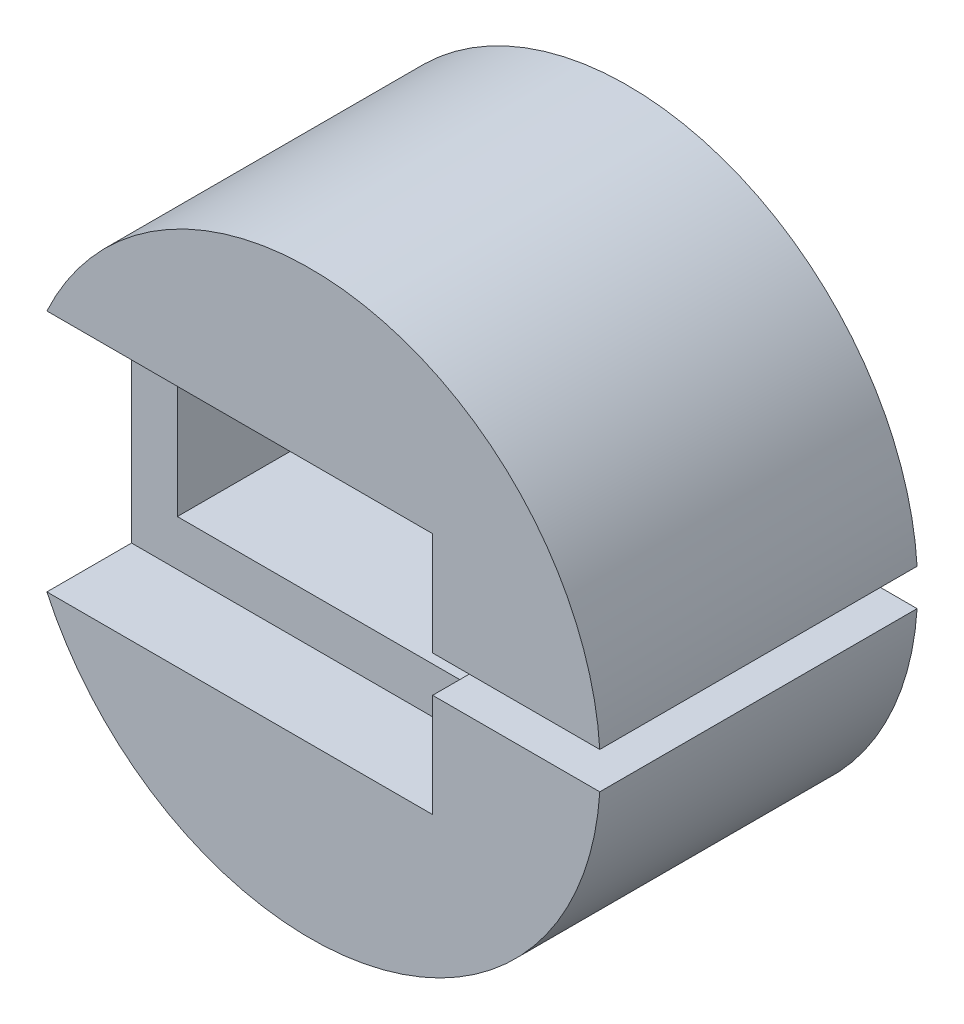
ISO-10303-21;
HEADER;
FILE_DESCRIPTION(('STEP AP214'),'2;1');
FILE_NAME('part.step','',(''),(''),'','','');
FILE_SCHEMA(('AUTOMOTIVE_DESIGN { 1 0 10303 214 1 1 1 1 }'));
ENDSEC;
DATA;
#1=APPLICATION_CONTEXT('core data for automotive mechanical design processes');
#2=APPLICATION_PROTOCOL_DEFINITION('international standard','automotive_design',2000,#1);
#3=PRODUCT_CONTEXT('',#1,'mechanical');
#4=PRODUCT('Part','Part','',(#3));
#5=PRODUCT_RELATED_PRODUCT_CATEGORY('part','',(#4));
#6=PRODUCT_DEFINITION_FORMATION('','',#4);
#7=PRODUCT_DEFINITION_CONTEXT('part definition',#1,'design');
#8=PRODUCT_DEFINITION('design','',#6,#7);
#9=PRODUCT_DEFINITION_SHAPE('','',#8);
#10=(LENGTH_UNIT() NAMED_UNIT(*) SI_UNIT(.MILLI.,.METRE.));
#11=(NAMED_UNIT(*) PLANE_ANGLE_UNIT() SI_UNIT($,.RADIAN.));
#12=(NAMED_UNIT(*) SI_UNIT($,.STERADIAN.) SOLID_ANGLE_UNIT());
#13=UNCERTAINTY_MEASURE_WITH_UNIT(LENGTH_MEASURE(1.E-05),#10,'distance_accuracy_value','');
#14=(GEOMETRIC_REPRESENTATION_CONTEXT(3) GLOBAL_UNCERTAINTY_ASSIGNED_CONTEXT((#13)) GLOBAL_UNIT_ASSIGNED_CONTEXT((#10,
#11,#12)) REPRESENTATION_CONTEXT('',''));
#15=CARTESIAN_POINT('',(0.,0.,0.));
#16=DIRECTION('',(0.,0.,1.));
#17=DIRECTION('',(1.,0.,0.));
#18=AXIS2_PLACEMENT_3D('',#15,#16,#17);
#19=CARTESIAN_POINT('',(10.849101298564,4.60000000000001,-92.6685344645156));
#20=DIRECTION('',(-1.,0.,0.));
#21=DIRECTION('',(0.,0.,1.));
#22=AXIS2_PLACEMENT_3D('',#19,#20,#21);
#23=PLANE('',#22);
#24=DIRECTION('',(0.,1.,0.));
#25=VECTOR('',#24,1.);
#26=CARTESIAN_POINT('',(10.849101298564,4.60000000000001,-28.));
#27=LINE('',#26,#25);
#28=CARTESIAN_POINT('',(10.849101298564,4.60000000000001,-28.));
#29=VERTEX_POINT('',#28);
#30=CARTESIAN_POINT('',(10.849101298564,10.749101298564,-28.));
#31=VERTEX_POINT('',#30);
#32=EDGE_CURVE('E46',#29,#31,#27,.T.);
#33=ORIENTED_EDGE('',*,*,#32,.F.);
#34=DIRECTION('',(0.,0.,1.));
#35=VECTOR('',#34,1.);
#36=CARTESIAN_POINT('',(10.849101298564,4.60000000000001,-92.6685344645156));
#37=LINE('',#36,#35);
#38=CARTESIAN_POINT('',(10.849101298564,4.60000000000001,0.));
#39=VERTEX_POINT('',#38);
#40=EDGE_CURVE('E162',#29,#39,#37,.T.);
#41=ORIENTED_EDGE('',*,*,#40,.T.);
#42=DIRECTION('',(0.,-1.,0.));
#43=VECTOR('',#42,1.);
#44=CARTESIAN_POINT('',(10.849101298564,4.60000000000001,0.));
#45=LINE('',#44,#43);
#46=CARTESIAN_POINT('',(10.849101298564,10.749101298564,0.));
#47=VERTEX_POINT('',#46);
#48=EDGE_CURVE('E124',#47,#39,#45,.T.);
#49=ORIENTED_EDGE('',*,*,#48,.F.);
#50=DIRECTION('',(0.,0.,1.));
#51=VECTOR('',#50,1.);
#52=CARTESIAN_POINT('',(10.849101298564,10.749101298564,-92.6685344645156));
#53=LINE('',#52,#51);
#54=EDGE_CURVE('E163',#31,#47,#53,.T.);
#55=ORIENTED_EDGE('',*,*,#54,.F.);
#56=EDGE_LOOP('',(#33,#41,#49,#55));
#57=FACE_BOUND('',#56,.T.);
#58=ADVANCED_FACE('F39',(#57),#23,.T.);
#59=CARTESIAN_POINT('',(10.849101298564,10.749101298564,-92.6685344645156));
#60=DIRECTION('',(0.,-1.,0.));
#61=DIRECTION('',(0.,0.,-1.));
#62=AXIS2_PLACEMENT_3D('',#59,#60,#61);
#63=PLANE('',#62);
#64=DIRECTION('',(-1.,0.,0.));
#65=VECTOR('',#64,1.);
#66=CARTESIAN_POINT('',(10.849101298564,10.749101298564,-28.));
#67=LINE('',#66,#65);
#68=CARTESIAN_POINT('',(-30.84910129856,10.749101298564,-28.));
#69=VERTEX_POINT('',#68);
#70=EDGE_CURVE('E75',#31,#69,#67,.T.);
#71=ORIENTED_EDGE('',*,*,#70,.F.);
#72=ORIENTED_EDGE('',*,*,#54,.T.);
#73=DIRECTION('',(1.,0.,0.));
#74=VECTOR('',#73,1.);
#75=CARTESIAN_POINT('',(10.849101298564,10.749101298564,0.));
#76=LINE('',#75,#74);
#77=CARTESIAN_POINT('',(-30.84910129856,10.749101298564,0.));
#78=VERTEX_POINT('',#77);
#79=EDGE_CURVE('E159',#78,#47,#76,.T.);
#80=ORIENTED_EDGE('',*,*,#79,.F.);
#81=DIRECTION('',(0.,0.,1.));
#82=VECTOR('',#81,1.);
#83=CARTESIAN_POINT('',(-30.84910129856,10.749101298564,-92.6685344645156));
#84=LINE('',#83,#82);
#85=EDGE_CURVE('E111',#69,#78,#84,.T.);
#86=ORIENTED_EDGE('',*,*,#85,.F.);
#87=EDGE_LOOP('',(#71,#72,#80,#86));
#88=FACE_BOUND('',#87,.T.);
#89=ADVANCED_FACE('F194',(#88),#63,.T.);
#90=CARTESIAN_POINT('',(-30.84910129856,10.749101298564,-92.6685344645156));
#91=DIRECTION('',(1.,0.,0.));
#92=DIRECTION('',(0.,0.,-1.));
#93=AXIS2_PLACEMENT_3D('',#90,#91,#92);
#94=PLANE('',#93);
#95=DIRECTION('',(0.,-1.,0.));
#96=VECTOR('',#95,1.);
#97=CARTESIAN_POINT('',(-30.84910129856,10.749101298564,-28.));
#98=LINE('',#97,#96);
#99=CARTESIAN_POINT('',(-30.84910129856,-10.74910129856,-28.));
#100=VERTEX_POINT('',#99);
#101=EDGE_CURVE('E104',#69,#100,#98,.T.);
#102=ORIENTED_EDGE('',*,*,#101,.F.);
#103=ORIENTED_EDGE('',*,*,#85,.T.);
#104=DIRECTION('',(0.,1.,0.));
#105=VECTOR('',#104,1.);
#106=CARTESIAN_POINT('',(-30.84910129856,10.749101298564,0.));
#107=LINE('',#106,#105);
#108=CARTESIAN_POINT('',(-30.84910129856,-10.74910129856,0.));
#109=VERTEX_POINT('',#108);
#110=EDGE_CURVE('E115',#109,#78,#107,.T.);
#111=ORIENTED_EDGE('',*,*,#110,.F.);
#112=DIRECTION('',(0.,0.,1.));
#113=VECTOR('',#112,1.);
#114=CARTESIAN_POINT('',(-30.84910129856,-10.74910129856,-92.6685344645156));
#115=LINE('',#114,#113);
#116=EDGE_CURVE('E98',#100,#109,#115,.T.);
#117=ORIENTED_EDGE('',*,*,#116,.F.);
#118=EDGE_LOOP('',(#102,#103,#111,#117));
#119=FACE_BOUND('',#118,.T.);
#120=ADVANCED_FACE('F108',(#119),#94,.T.);
#121=CARTESIAN_POINT('',(-30.84910129856,-10.74910129856,-92.6685344645156));
#122=DIRECTION('',(0.,1.,0.));
#123=DIRECTION('',(0.,0.,1.));
#124=AXIS2_PLACEMENT_3D('',#121,#122,#123);
#125=PLANE('',#124);
#126=DIRECTION('',(1.,0.,0.));
#127=VECTOR('',#126,1.);
#128=CARTESIAN_POINT('',(-30.84910129856,-10.74910129856,-28.));
#129=LINE('',#128,#127);
#130=CARTESIAN_POINT('',(10.849101298564,-10.74910129856,-28.));
#131=VERTEX_POINT('',#130);
#132=EDGE_CURVE('E91',#100,#131,#129,.T.);
#133=ORIENTED_EDGE('',*,*,#132,.F.);
#134=ORIENTED_EDGE('',*,*,#116,.T.);
#135=DIRECTION('',(-1.,0.,0.));
#136=VECTOR('',#135,1.);
#137=CARTESIAN_POINT('',(-30.84910129856,-10.74910129856,0.));
#138=LINE('',#137,#136);
#139=CARTESIAN_POINT('',(10.849101298564,-10.74910129856,0.));
#140=VERTEX_POINT('',#139);
#141=EDGE_CURVE('E160',#140,#109,#138,.T.);
#142=ORIENTED_EDGE('',*,*,#141,.F.);
#143=DIRECTION('',(0.,0.,1.));
#144=VECTOR('',#143,1.);
#145=CARTESIAN_POINT('',(10.849101298564,-10.74910129856,-92.6685344645156));
#146=LINE('',#145,#144);
#147=EDGE_CURVE('E101',#131,#140,#146,.T.);
#148=ORIENTED_EDGE('',*,*,#147,.F.);
#149=EDGE_LOOP('',(#133,#134,#142,#148));
#150=FACE_BOUND('',#149,.T.);
#151=ADVANCED_FACE('F92',(#150),#125,.T.);
#152=CARTESIAN_POINT('',(10.849101298564,-10.74910129856,-92.6685344645156));
#153=DIRECTION('',(-1.,0.,0.));
#154=DIRECTION('',(0.,0.,1.));
#155=AXIS2_PLACEMENT_3D('',#152,#153,#154);
#156=PLANE('',#155);
#157=DIRECTION('',(0.,1.,0.));
#158=VECTOR('',#157,1.);
#159=CARTESIAN_POINT('',(10.849101298564,-10.74910129856,-28.));
#160=LINE('',#159,#158);
#161=CARTESIAN_POINT('',(10.849101298564,-4.60000000000001,-28.));
#162=VERTEX_POINT('',#161);
#163=EDGE_CURVE('E106',#131,#162,#160,.T.);
#164=ORIENTED_EDGE('',*,*,#163,.F.);
#165=ORIENTED_EDGE('',*,*,#147,.T.);
#166=DIRECTION('',(0.,-1.,0.));
#167=VECTOR('',#166,1.);
#168=CARTESIAN_POINT('',(10.849101298564,-10.74910129856,0.));
#169=LINE('',#168,#167);
#170=CARTESIAN_POINT('',(10.849101298564,-4.60000000000001,0.));
#171=VERTEX_POINT('',#170);
#172=EDGE_CURVE('E152',#171,#140,#169,.T.);
#173=ORIENTED_EDGE('',*,*,#172,.F.);
#174=DIRECTION('',(0.,0.,1.));
#175=VECTOR('',#174,1.);
#176=CARTESIAN_POINT('',(10.849101298564,-4.60000000000001,-92.6685344645156));
#177=LINE('',#176,#175);
#178=EDGE_CURVE('E166',#162,#171,#177,.T.);
#179=ORIENTED_EDGE('',*,*,#178,.F.);
#180=EDGE_LOOP('',(#164,#165,#173,#179));
#181=FACE_BOUND('',#180,.T.);
#182=ADVANCED_FACE('F341',(#181),#156,.T.);
#183=CARTESIAN_POINT('',(10.849101298564,-4.60000000000001,-92.6685344645156));
#184=DIRECTION('',(-0.707106781186549,0.707106781186546,0.));
#185=DIRECTION('',(-0.707106781186546,-0.707106781186549,0.));
#186=AXIS2_PLACEMENT_3D('',#183,#184,#185);
#187=PLANE('',#186);
#188=DIRECTION('',(0.707106781186546,0.707106781186549,0.));
#189=VECTOR('',#188,1.);
#190=CARTESIAN_POINT('',(10.849101298564,-4.60000000000001,-28.));
#191=LINE('',#190,#189);
#192=CARTESIAN_POINT('',(12.849101298564,-2.6,-28.));
#193=VERTEX_POINT('',#192);
#194=EDGE_CURVE('E59',#162,#193,#191,.T.);
#195=ORIENTED_EDGE('',*,*,#194,.F.);
#196=ORIENTED_EDGE('',*,*,#178,.T.);
#197=DIRECTION('',(-0.707106781186546,-0.707106781186549,0.));
#198=VECTOR('',#197,1.);
#199=CARTESIAN_POINT('',(10.849101298564,-4.60000000000001,0.));
#200=LINE('',#199,#198);
#201=CARTESIAN_POINT('',(12.849101298564,-2.6,0.));
#202=VERTEX_POINT('',#201);
#203=EDGE_CURVE('E151',#202,#171,#200,.T.);
#204=ORIENTED_EDGE('',*,*,#203,.F.);
#205=DIRECTION('',(0.,0.,1.));
#206=VECTOR('',#205,1.);
#207=CARTESIAN_POINT('',(12.849101298564,-2.6,-92.6685344645156));
#208=LINE('',#207,#206);
#209=EDGE_CURVE('E52',#193,#202,#208,.T.);
#210=ORIENTED_EDGE('',*,*,#209,.F.);
#211=EDGE_LOOP('',(#195,#196,#204,#210));
#212=FACE_BOUND('',#211,.T.);
#213=ADVANCED_FACE('F344',(#212),#187,.T.);
#214=CARTESIAN_POINT('',(12.849101298564,-2.6,-92.6685344645156));
#215=DIRECTION('',(0.,1.,0.));
#216=DIRECTION('',(0.,0.,1.));
#217=AXIS2_PLACEMENT_3D('',#214,#215,#216);
#218=PLANE('',#217);
#219=DIRECTION('',(-1.,0.,0.));
#220=VECTOR('',#219,1.);
#221=CARTESIAN_POINT('',(12.849101298564,-2.6,0.));
#222=LINE('',#221,#220);
#223=CARTESIAN_POINT('',(17.349101298564,-2.6,0.));
#224=VERTEX_POINT('',#223);
#225=EDGE_CURVE('E146',#224,#202,#222,.T.);
#226=ORIENTED_EDGE('',*,*,#225,.F.);
#227=DIRECTION('',(0.,0.,-1.));
#228=VECTOR('',#227,1.);
#229=CARTESIAN_POINT('',(17.349101298564,-2.6,12.));
#230=LINE('',#229,#228);
#231=CARTESIAN_POINT('',(17.349101298564,-2.6,12.));
#232=VERTEX_POINT('',#231);
#233=EDGE_CURVE('E281',#232,#224,#230,.T.);
#234=ORIENTED_EDGE('',*,*,#233,.F.);
#235=DIRECTION('',(-1.,0.,0.));
#236=VECTOR('',#235,1.);
#237=CARTESIAN_POINT('',(41.0576042094302,-2.59999999999998,12.));
#238=LINE('',#237,#236);
#239=CARTESIAN_POINT('',(41.0576042094302,-2.59999999999998,12.));
#240=VERTEX_POINT('',#239);
#241=EDGE_CURVE('E279',#240,#232,#238,.T.);
#242=ORIENTED_EDGE('',*,*,#241,.F.);
#243=DIRECTION('',(0.,0.,1.));
#244=VECTOR('',#243,1.);
#245=CARTESIAN_POINT('',(41.0576042094302,-2.59999999999998,-33.));
#246=LINE('',#245,#244);
#247=CARTESIAN_POINT('',(41.0576042094302,-2.59999999999998,-33.));
#248=VERTEX_POINT('',#247);
#249=EDGE_CURVE('E266',#248,#240,#246,.T.);
#250=ORIENTED_EDGE('',*,*,#249,.F.);
#251=DIRECTION('',(1.,0.,0.));
#252=VECTOR('',#251,1.);
#253=CARTESIAN_POINT('',(12.849101298564,-2.6,-33.));
#254=LINE('',#253,#252);
#255=CARTESIAN_POINT('',(12.849101298564,-2.6,-33.));
#256=VERTEX_POINT('',#255);
#257=EDGE_CURVE('E321',#256,#248,#254,.T.);
#258=ORIENTED_EDGE('',*,*,#257,.F.);
#259=DIRECTION('',(0.,0.,1.));
#260=VECTOR('',#259,1.);
#261=CARTESIAN_POINT('',(12.849101298564,-2.6,-33.));
#262=LINE('',#261,#260);
#263=EDGE_CURVE('E130',#256,#193,#262,.T.);
#264=ORIENTED_EDGE('',*,*,#263,.T.);
#265=ORIENTED_EDGE('',*,*,#209,.T.);
#266=EDGE_LOOP('',(#226,#234,#242,#250,#258,#264,#265));
#267=FACE_BOUND('',#266,.T.);
#268=ADVANCED_FACE('F278',(#267),#218,.T.);
#269=CARTESIAN_POINT('',(-37.34910129856,17.249101298564,-92.6685344645156));
#270=DIRECTION('',(-1.,0.,0.));
#271=DIRECTION('',(0.,-1.,0.));
#272=AXIS2_PLACEMENT_3D('',#269,#270,#271);
#273=PLANE('',#272);
#274=DIRECTION('',(0.,1.,0.));
#275=VECTOR('',#274,1.);
#276=CARTESIAN_POINT('',(-37.34910129856,17.249101298564,-28.));
#277=LINE('',#276,#275);
#278=CARTESIAN_POINT('',(-37.34910129856,-17.24910129856,-28.));
#279=VERTEX_POINT('',#278);
#280=CARTESIAN_POINT('',(-37.34910129856,17.249101298564,-28.));
#281=VERTEX_POINT('',#280);
#282=EDGE_CURVE('E167',#279,#281,#277,.T.);
#283=ORIENTED_EDGE('',*,*,#282,.F.);
#284=DIRECTION('',(0.,0.,1.));
#285=VECTOR('',#284,1.);
#286=CARTESIAN_POINT('',(-37.34910129856,-17.24910129856,-92.6685344645156));
#287=LINE('',#286,#285);
#288=CARTESIAN_POINT('',(-37.34910129856,-17.24910129856,0.));
#289=VERTEX_POINT('',#288);
#290=EDGE_CURVE('E175',#279,#289,#287,.T.);
#291=ORIENTED_EDGE('',*,*,#290,.T.);
#292=DIRECTION('',(0.,-1.,0.));
#293=VECTOR('',#292,1.);
#294=CARTESIAN_POINT('',(-37.34910129856,17.249101298564,0.));
#295=LINE('',#294,#293);
#296=CARTESIAN_POINT('',(-37.34910129856,17.249101298564,0.));
#297=VERTEX_POINT('',#296);
#298=EDGE_CURVE('E138',#297,#289,#295,.T.);
#299=ORIENTED_EDGE('',*,*,#298,.F.);
#300=DIRECTION('',(0.,0.,1.));
#301=VECTOR('',#300,1.);
#302=CARTESIAN_POINT('',(-37.34910129856,17.249101298564,-92.6685344645156));
#303=LINE('',#302,#301);
#304=EDGE_CURVE('E174',#281,#297,#303,.T.);
#305=ORIENTED_EDGE('',*,*,#304,.F.);
#306=EDGE_LOOP('',(#283,#291,#299,#305));
#307=FACE_BOUND('',#306,.T.);
#308=ADVANCED_FACE('F369',(#307),#273,.T.);
#309=CARTESIAN_POINT('',(12.849101298564,2.6,-92.6685344645156));
#310=DIRECTION('',(0.,-1.,0.));
#311=DIRECTION('',(0.,0.,-1.));
#312=AXIS2_PLACEMENT_3D('',#309,#310,#311);
#313=PLANE('',#312);
#314=DIRECTION('',(0.,0.,-1.));
#315=VECTOR('',#314,1.);
#316=CARTESIAN_POINT('',(17.349101298564,2.6,12.));
#317=LINE('',#316,#315);
#318=CARTESIAN_POINT('',(17.349101298564,2.6,12.));
#319=VERTEX_POINT('',#318);
#320=CARTESIAN_POINT('',(17.349101298564,2.6,0.));
#321=VERTEX_POINT('',#320);
#322=EDGE_CURVE('E310',#319,#321,#317,.T.);
#323=ORIENTED_EDGE('',*,*,#322,.T.);
#324=DIRECTION('',(1.,0.,0.));
#325=VECTOR('',#324,1.);
#326=CARTESIAN_POINT('',(12.849101298564,2.6,0.));
#327=LINE('',#326,#325);
#328=CARTESIAN_POINT('',(12.849101298564,2.6,0.));
#329=VERTEX_POINT('',#328);
#330=EDGE_CURVE('E128',#329,#321,#327,.T.);
#331=ORIENTED_EDGE('',*,*,#330,.F.);
#332=DIRECTION('',(0.,0.,1.));
#333=VECTOR('',#332,1.);
#334=CARTESIAN_POINT('',(12.849101298564,2.6,-92.6685344645156));
#335=LINE('',#334,#333);
#336=CARTESIAN_POINT('',(12.849101298564,2.6,-28.));
#337=VERTEX_POINT('',#336);
#338=EDGE_CURVE('E84',#337,#329,#335,.T.);
#339=ORIENTED_EDGE('',*,*,#338,.F.);
#340=DIRECTION('',(0.,0.,1.));
#341=VECTOR('',#340,1.);
#342=CARTESIAN_POINT('',(12.849101298564,2.6,-33.));
#343=LINE('',#342,#341);
#344=CARTESIAN_POINT('',(12.849101298564,2.6,-33.));
#345=VERTEX_POINT('',#344);
#346=EDGE_CURVE('E330',#345,#337,#343,.T.);
#347=ORIENTED_EDGE('',*,*,#346,.F.);
#348=DIRECTION('',(-1.,0.,0.));
#349=VECTOR('',#348,1.);
#350=CARTESIAN_POINT('',(12.849101298564,2.6,-33.));
#351=LINE('',#350,#349);
#352=CARTESIAN_POINT('',(41.0576042094302,2.6,-33.));
#353=VERTEX_POINT('',#352);
#354=EDGE_CURVE('E324',#353,#345,#351,.T.);
#355=ORIENTED_EDGE('',*,*,#354,.F.);
#356=DIRECTION('',(0.,0.,1.));
#357=VECTOR('',#356,1.);
#358=CARTESIAN_POINT('',(41.0576042094302,2.6,-33.));
#359=LINE('',#358,#357);
#360=CARTESIAN_POINT('',(41.0576042094302,2.6,12.));
#361=VERTEX_POINT('',#360);
#362=EDGE_CURVE('E274',#353,#361,#359,.T.);
#363=ORIENTED_EDGE('',*,*,#362,.T.);
#364=DIRECTION('',(1.,0.,0.));
#365=VECTOR('',#364,1.);
#366=CARTESIAN_POINT('',(17.349101298564,2.6,12.));
#367=LINE('',#366,#365);
#368=EDGE_CURVE('E315',#319,#361,#367,.T.);
#369=ORIENTED_EDGE('',*,*,#368,.F.);
#370=EDGE_LOOP('',(#323,#331,#339,#347,#355,#363,#369));
#371=FACE_BOUND('',#370,.T.);
#372=ADVANCED_FACE('F348',(#371),#313,.T.);
#373=CARTESIAN_POINT('',(10.849101298564,4.60000000000001,-92.6685344645156));
#374=DIRECTION('',(-0.707106781186549,-0.707106781186546,0.));
#375=DIRECTION('',(0.707106781186546,-0.707106781186549,0.));
#376=AXIS2_PLACEMENT_3D('',#373,#374,#375);
#377=PLANE('',#376);
#378=DIRECTION('',(-0.707106781186546,0.707106781186549,0.));
#379=VECTOR('',#378,1.);
#380=CARTESIAN_POINT('',(10.849101298564,4.60000000000001,-28.));
#381=LINE('',#380,#379);
#382=EDGE_CURVE('E11',#337,#29,#381,.T.);
#383=ORIENTED_EDGE('',*,*,#382,.F.);
#384=ORIENTED_EDGE('',*,*,#338,.T.);
#385=DIRECTION('',(0.707106781186546,-0.707106781186549,0.));
#386=VECTOR('',#385,1.);
#387=CARTESIAN_POINT('',(10.849101298564,4.60000000000001,0.));
#388=LINE('',#387,#386);
#389=EDGE_CURVE('E127',#39,#329,#388,.T.);
#390=ORIENTED_EDGE('',*,*,#389,.F.);
#391=ORIENTED_EDGE('',*,*,#40,.F.);
#392=EDGE_LOOP('',(#383,#384,#390,#391));
#393=FACE_BOUND('',#392,.T.);
#394=ADVANCED_FACE('F188',(#393),#377,.T.);
#395=CARTESIAN_POINT('',(0.,0.,0.));
#396=DIRECTION('',(0.,0.,1.));
#397=DIRECTION('',(1.,0.,0.));
#398=AXIS2_PLACEMENT_3D('',#395,#396,#397);
#399=PLANE('',#398);
#400=ORIENTED_EDGE('',*,*,#48,.T.);
#401=ORIENTED_EDGE('',*,*,#389,.T.);
#402=ORIENTED_EDGE('',*,*,#330,.T.);
#403=DIRECTION('',(0.,1.,0.));
#404=VECTOR('',#403,1.);
#405=CARTESIAN_POINT('',(17.349101298564,2.6,0.));
#406=LINE('',#405,#404);
#407=CARTESIAN_POINT('',(17.349101298564,17.249101298564,0.));
#408=VERTEX_POINT('',#407);
#409=EDGE_CURVE('E132',#321,#408,#406,.T.);
#410=ORIENTED_EDGE('',*,*,#409,.T.);
#411=DIRECTION('',(-1.,0.,0.));
#412=VECTOR('',#411,1.);
#413=CARTESIAN_POINT('',(17.349101298564,17.249101298564,0.));
#414=LINE('',#413,#412);
#415=EDGE_CURVE('E136',#408,#297,#414,.T.);
#416=ORIENTED_EDGE('',*,*,#415,.T.);
#417=ORIENTED_EDGE('',*,*,#298,.T.);
#418=DIRECTION('',(1.,0.,0.));
#419=VECTOR('',#418,1.);
#420=CARTESIAN_POINT('',(-37.34910129856,-17.24910129856,0.));
#421=LINE('',#420,#419);
#422=CARTESIAN_POINT('',(17.349101298564,-17.24910129856,0.));
#423=VERTEX_POINT('',#422);
#424=EDGE_CURVE('E142',#289,#423,#421,.T.);
#425=ORIENTED_EDGE('',*,*,#424,.T.);
#426=DIRECTION('',(0.,1.,0.));
#427=VECTOR('',#426,1.);
#428=CARTESIAN_POINT('',(17.349101298564,-17.24910129856,0.));
#429=LINE('',#428,#427);
#430=EDGE_CURVE('E144',#423,#224,#429,.T.);
#431=ORIENTED_EDGE('',*,*,#430,.T.);
#432=ORIENTED_EDGE('',*,*,#225,.T.);
#433=ORIENTED_EDGE('',*,*,#203,.T.);
#434=ORIENTED_EDGE('',*,*,#172,.T.);
#435=ORIENTED_EDGE('',*,*,#141,.T.);
#436=ORIENTED_EDGE('',*,*,#110,.T.);
#437=ORIENTED_EDGE('',*,*,#79,.T.);
#438=EDGE_LOOP('',(#400,#401,#402,#410,#416,#417,#425,#431,#432,#433,#434,#435,#436,#437));
#439=FACE_BOUND('',#438,.T.);
#440=ADVANCED_FACE('F191',(#439),#399,.T.);
#441=CARTESIAN_POINT('',(0.,0.,-28.));
#442=DIRECTION('',(0.,0.,-1.));
#443=DIRECTION('',(-1.,0.,0.));
#444=AXIS2_PLACEMENT_3D('',#441,#442,#443);
#445=PLANE('',#444);
#446=CARTESIAN_POINT('',(0.,0.,-28.));
#447=DIRECTION('',(0.,0.,-1.));
#448=DIRECTION('',(-1.,0.,0.));
#449=AXIS2_PLACEMENT_3D('',#446,#447,#448);
#450=CIRCLE('',#449,41.139845204111);
#451=EDGE_CURVE('E325',#279,#281,#450,.T.);
#452=ORIENTED_EDGE('',*,*,#451,.F.);
#453=ORIENTED_EDGE('',*,*,#282,.T.);
#454=EDGE_LOOP('',(#452,#453));
#455=FACE_BOUND('',#454,.T.);
#456=ADVANCED_FACE('F374',(#455),#445,.F.);
#457=CARTESIAN_POINT('',(12.849101298564,2.6,-33.));
#458=DIRECTION('',(-1.,0.,0.));
#459=DIRECTION('',(0.,0.,1.));
#460=AXIS2_PLACEMENT_3D('',#457,#458,#459);
#461=PLANE('',#460);
#462=DIRECTION('',(0.,-1.,0.));
#463=VECTOR('',#462,1.);
#464=CARTESIAN_POINT('',(12.849101298564,2.6,-28.));
#465=LINE('',#464,#463);
#466=EDGE_CURVE('E304',#337,#193,#465,.T.);
#467=ORIENTED_EDGE('',*,*,#466,.T.);
#468=ORIENTED_EDGE('',*,*,#263,.F.);
#469=DIRECTION('',(0.,-1.,0.));
#470=VECTOR('',#469,1.);
#471=CARTESIAN_POINT('',(12.849101298564,2.6,-33.));
#472=LINE('',#471,#470);
#473=EDGE_CURVE('E318',#345,#256,#472,.T.);
#474=ORIENTED_EDGE('',*,*,#473,.F.);
#475=ORIENTED_EDGE('',*,*,#346,.T.);
#476=EDGE_LOOP('',(#467,#468,#474,#475));
#477=FACE_BOUND('',#476,.T.);
#478=ADVANCED_FACE('F346',(#477),#461,.F.);
#479=CARTESIAN_POINT('',(0.,0.,-33.));
#480=DIRECTION('',(0.,0.,1.));
#481=DIRECTION('',(1.,0.,0.));
#482=AXIS2_PLACEMENT_3D('',#479,#480,#481);
#483=CYLINDRICAL_SURFACE('',#482,41.139845204111);
#484=ORIENTED_EDGE('',*,*,#249,.T.);
#485=CARTESIAN_POINT('',(0.,0.,12.));
#486=DIRECTION('',(0.,0.,1.));
#487=DIRECTION('',(1.,0.,0.));
#488=AXIS2_PLACEMENT_3D('',#485,#486,#487);
#489=CIRCLE('',#488,41.1398452041102);
#490=CARTESIAN_POINT('',(-37.34910129856,-17.24910129856,12.));
#491=VERTEX_POINT('',#490);
#492=EDGE_CURVE('E271',#491,#240,#489,.T.);
#493=ORIENTED_EDGE('',*,*,#492,.F.);
#494=DIRECTION('',(0.,0.,-1.));
#495=VECTOR('',#494,1.);
#496=CARTESIAN_POINT('',(-37.34910129856,-17.24910129856,12.));
#497=LINE('',#496,#495);
#498=EDGE_CURVE('E297',#491,#289,#497,.T.);
#499=ORIENTED_EDGE('',*,*,#498,.T.);
#500=ORIENTED_EDGE('',*,*,#290,.F.);
#501=ORIENTED_EDGE('',*,*,#451,.T.);
#502=ORIENTED_EDGE('',*,*,#304,.T.);
#503=DIRECTION('',(0.,0.,-1.));
#504=VECTOR('',#503,1.);
#505=CARTESIAN_POINT('',(-37.34910129856,17.249101298564,12.));
#506=LINE('',#505,#504);
#507=CARTESIAN_POINT('',(-37.34910129856,17.249101298564,12.));
#508=VERTEX_POINT('',#507);
#509=EDGE_CURVE('E303',#508,#297,#506,.T.);
#510=ORIENTED_EDGE('',*,*,#509,.F.);
#511=CARTESIAN_POINT('',(0.,0.,12.));
#512=DIRECTION('',(0.,0.,1.));
#513=DIRECTION('',(1.,0.,0.));
#514=AXIS2_PLACEMENT_3D('',#511,#512,#513);
#515=CIRCLE('',#514,41.139845204111);
#516=EDGE_CURVE('E290',#361,#508,#515,.T.);
#517=ORIENTED_EDGE('',*,*,#516,.F.);
#518=ORIENTED_EDGE('',*,*,#362,.F.);
#519=CARTESIAN_POINT('',(0.,0.,-33.));
#520=DIRECTION('',(0.,0.,-1.));
#521=DIRECTION('',(-1.,0.,0.));
#522=AXIS2_PLACEMENT_3D('',#519,#520,#521);
#523=CIRCLE('',#522,41.139845204111);
#524=EDGE_CURVE('E272',#248,#353,#523,.T.);
#525=ORIENTED_EDGE('',*,*,#524,.F.);
#526=EDGE_LOOP('',(#484,#493,#499,#500,#501,#502,#510,#517,#518,#525));
#527=FACE_BOUND('',#526,.T.);
#528=ADVANCED_FACE('F268',(#527),#483,.T.);
#529=CARTESIAN_POINT('',(0.,0.,-33.));
#530=DIRECTION('',(0.,0.,-1.));
#531=DIRECTION('',(-1.,0.,0.));
#532=AXIS2_PLACEMENT_3D('',#529,#530,#531);
#533=PLANE('',#532);
#534=ORIENTED_EDGE('',*,*,#473,.T.);
#535=ORIENTED_EDGE('',*,*,#257,.T.);
#536=ORIENTED_EDGE('',*,*,#524,.T.);
#537=ORIENTED_EDGE('',*,*,#354,.T.);
#538=EDGE_LOOP('',(#534,#535,#536,#537));
#539=FACE_BOUND('',#538,.T.);
#540=ADVANCED_FACE('F352',(#539),#533,.T.);
#541=ORIENTED_EDGE('',*,*,#163,.T.);
#542=ORIENTED_EDGE('',*,*,#194,.T.);
#543=ORIENTED_EDGE('',*,*,#466,.F.);
#544=ORIENTED_EDGE('',*,*,#382,.T.);
#545=ORIENTED_EDGE('',*,*,#32,.T.);
#546=ORIENTED_EDGE('',*,*,#70,.T.);
#547=ORIENTED_EDGE('',*,*,#101,.T.);
#548=ORIENTED_EDGE('',*,*,#132,.T.);
#549=EDGE_LOOP('',(#541,#542,#543,#544,#545,#546,#547,#548));
#550=FACE_BOUND('',#549,.T.);
#551=ADVANCED_FACE('F116',(#550),#445,.F.);
#552=CARTESIAN_POINT('',(-37.34910129856,17.249101298564,12.));
#553=DIRECTION('',(0.,1.,0.));
#554=DIRECTION('',(-1.,0.,0.));
#555=AXIS2_PLACEMENT_3D('',#552,#553,#554);
#556=PLANE('',#555);
#557=ORIENTED_EDGE('',*,*,#415,.F.);
#558=DIRECTION('',(0.,0.,-1.));
#559=VECTOR('',#558,1.);
#560=CARTESIAN_POINT('',(17.349101298564,17.249101298564,12.));
#561=LINE('',#560,#559);
#562=CARTESIAN_POINT('',(17.349101298564,17.249101298564,12.));
#563=VERTEX_POINT('',#562);
#564=EDGE_CURVE('E307',#563,#408,#561,.T.);
#565=ORIENTED_EDGE('',*,*,#564,.F.);
#566=DIRECTION('',(1.,0.,0.));
#567=VECTOR('',#566,1.);
#568=CARTESIAN_POINT('',(-37.34910129856,17.249101298564,12.));
#569=LINE('',#568,#567);
#570=EDGE_CURVE('E291',#508,#563,#569,.T.);
#571=ORIENTED_EDGE('',*,*,#570,.F.);
#572=ORIENTED_EDGE('',*,*,#509,.T.);
#573=EDGE_LOOP('',(#557,#565,#571,#572));
#574=FACE_BOUND('',#573,.T.);
#575=ADVANCED_FACE('F364',(#574),#556,.F.);
#576=CARTESIAN_POINT('',(17.349101298564,17.249101298564,12.));
#577=DIRECTION('',(1.,0.,0.));
#578=DIRECTION('',(0.,0.,-1.));
#579=AXIS2_PLACEMENT_3D('',#576,#577,#578);
#580=PLANE('',#579);
#581=ORIENTED_EDGE('',*,*,#409,.F.);
#582=ORIENTED_EDGE('',*,*,#322,.F.);
#583=DIRECTION('',(0.,-1.,0.));
#584=VECTOR('',#583,1.);
#585=CARTESIAN_POINT('',(17.349101298564,17.249101298564,12.));
#586=LINE('',#585,#584);
#587=EDGE_CURVE('E312',#563,#319,#586,.T.);
#588=ORIENTED_EDGE('',*,*,#587,.F.);
#589=ORIENTED_EDGE('',*,*,#564,.T.);
#590=EDGE_LOOP('',(#581,#582,#588,#589));
#591=FACE_BOUND('',#590,.T.);
#592=ADVANCED_FACE('F361',(#591),#580,.F.);
#593=CARTESIAN_POINT('',(0.,0.,12.));
#594=DIRECTION('',(0.,0.,1.));
#595=DIRECTION('',(1.,0.,0.));
#596=AXIS2_PLACEMENT_3D('',#593,#594,#595);
#597=PLANE('',#596);
#598=ORIENTED_EDGE('',*,*,#516,.T.);
#599=ORIENTED_EDGE('',*,*,#570,.T.);
#600=ORIENTED_EDGE('',*,*,#587,.T.);
#601=ORIENTED_EDGE('',*,*,#368,.T.);
#602=EDGE_LOOP('',(#598,#599,#600,#601));
#603=FACE_BOUND('',#602,.T.);
#604=ADVANCED_FACE('F357',(#603),#597,.T.);
#605=CARTESIAN_POINT('',(17.349101298564,-2.6,12.));
#606=DIRECTION('',(1.,0.,0.));
#607=DIRECTION('',(0.,0.,-1.));
#608=AXIS2_PLACEMENT_3D('',#605,#606,#607);
#609=PLANE('',#608);
#610=ORIENTED_EDGE('',*,*,#430,.F.);
#611=DIRECTION('',(0.,0.,-1.));
#612=VECTOR('',#611,1.);
#613=CARTESIAN_POINT('',(17.349101298564,-17.24910129856,12.));
#614=LINE('',#613,#612);
#615=CARTESIAN_POINT('',(17.349101298564,-17.24910129856,12.));
#616=VERTEX_POINT('',#615);
#617=EDGE_CURVE('E299',#616,#423,#614,.T.);
#618=ORIENTED_EDGE('',*,*,#617,.F.);
#619=DIRECTION('',(0.,-1.,0.));
#620=VECTOR('',#619,1.);
#621=CARTESIAN_POINT('',(17.349101298564,-2.6,12.));
#622=LINE('',#621,#620);
#623=EDGE_CURVE('E283',#232,#616,#622,.T.);
#624=ORIENTED_EDGE('',*,*,#623,.F.);
#625=ORIENTED_EDGE('',*,*,#233,.T.);
#626=EDGE_LOOP('',(#610,#618,#624,#625));
#627=FACE_BOUND('',#626,.T.);
#628=ADVANCED_FACE('F496',(#627),#609,.F.);
#629=CARTESIAN_POINT('',(17.349101298564,-17.24910129856,12.));
#630=DIRECTION('',(0.,-1.,0.));
#631=DIRECTION('',(1.,0.,0.));
#632=AXIS2_PLACEMENT_3D('',#629,#630,#631);
#633=PLANE('',#632);
#634=ORIENTED_EDGE('',*,*,#424,.F.);
#635=ORIENTED_EDGE('',*,*,#498,.F.);
#636=DIRECTION('',(-1.,0.,0.));
#637=VECTOR('',#636,1.);
#638=CARTESIAN_POINT('',(17.349101298564,-17.24910129856,12.));
#639=LINE('',#638,#637);
#640=EDGE_CURVE('E289',#616,#491,#639,.T.);
#641=ORIENTED_EDGE('',*,*,#640,.F.);
#642=ORIENTED_EDGE('',*,*,#617,.T.);
#643=EDGE_LOOP('',(#634,#635,#641,#642));
#644=FACE_BOUND('',#643,.T.);
#645=ADVANCED_FACE('F371',(#644),#633,.F.);
#646=CARTESIAN_POINT('',(0.,0.,12.));
#647=DIRECTION('',(0.,0.,1.));
#648=DIRECTION('',(1.,0.,0.));
#649=AXIS2_PLACEMENT_3D('',#646,#647,#648);
#650=PLANE('',#649);
#651=ORIENTED_EDGE('',*,*,#492,.T.);
#652=ORIENTED_EDGE('',*,*,#241,.T.);
#653=ORIENTED_EDGE('',*,*,#623,.T.);
#654=ORIENTED_EDGE('',*,*,#640,.T.);
#655=EDGE_LOOP('',(#651,#652,#653,#654));
#656=FACE_BOUND('',#655,.T.);
#657=ADVANCED_FACE('F286',(#656),#650,.T.);
#658=CLOSED_SHELL('',(#58,#89,#120,#151,#182,#213,#268,#308,#372,#394,#440,#456,#478,#528,#540,
#551,#575,#592,#604,#628,#645,#657));
#659=MANIFOLD_SOLID_BREP('B2',#658);
#660=ADVANCED_BREP_SHAPE_REPRESENTATION('',(#18,#659),#14);
#661=SHAPE_DEFINITION_REPRESENTATION(#9,#660);
ENDSEC;
END-ISO-10303-21;
